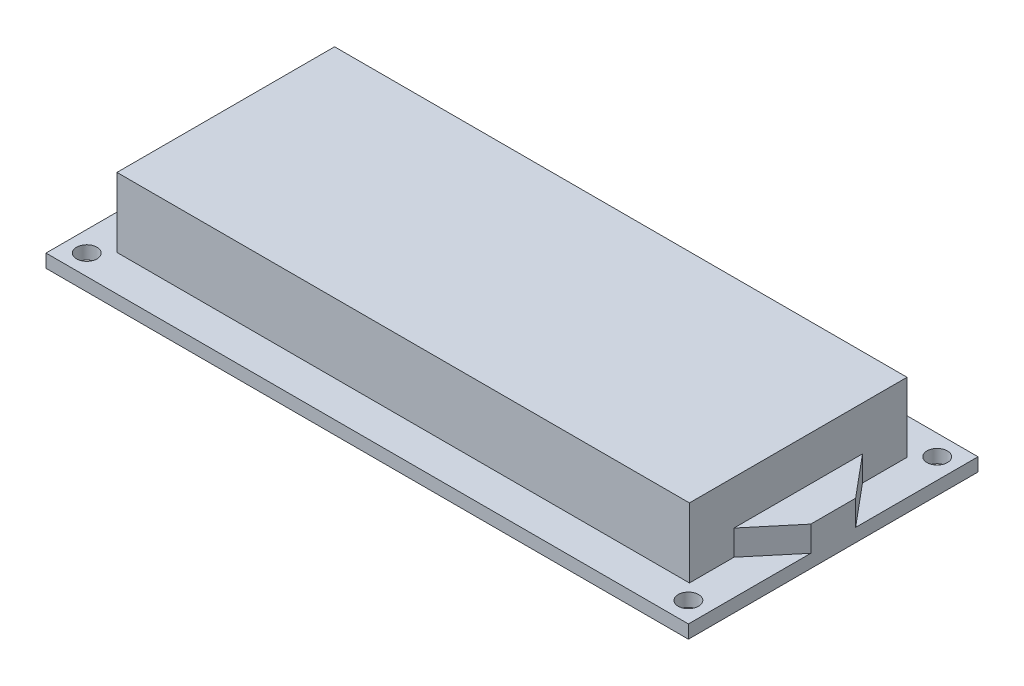
ISO-10303-21;
HEADER;
FILE_DESCRIPTION(('STEP AP214'),'2;1');
FILE_NAME('part.step','',(''),(''),'','','');
FILE_SCHEMA(('AUTOMOTIVE_DESIGN { 1 0 10303 214 1 1 1 1 }'));
ENDSEC;
DATA;
#1=APPLICATION_CONTEXT('core data for automotive mechanical design processes');
#2=APPLICATION_PROTOCOL_DEFINITION('international standard','automotive_design',2000,#1);
#3=PRODUCT_CONTEXT('',#1,'mechanical');
#4=PRODUCT('Part','Part','',(#3));
#5=PRODUCT_RELATED_PRODUCT_CATEGORY('part','',(#4));
#6=PRODUCT_DEFINITION_FORMATION('','',#4);
#7=PRODUCT_DEFINITION_CONTEXT('part definition',#1,'design');
#8=PRODUCT_DEFINITION('design','',#6,#7);
#9=PRODUCT_DEFINITION_SHAPE('','',#8);
#10=(LENGTH_UNIT() NAMED_UNIT(*) SI_UNIT(.MILLI.,.METRE.));
#11=(NAMED_UNIT(*) PLANE_ANGLE_UNIT() SI_UNIT($,.RADIAN.));
#12=(NAMED_UNIT(*) SI_UNIT($,.STERADIAN.) SOLID_ANGLE_UNIT());
#13=UNCERTAINTY_MEASURE_WITH_UNIT(LENGTH_MEASURE(1.E-05),#10,'distance_accuracy_value','');
#14=(GEOMETRIC_REPRESENTATION_CONTEXT(3) GLOBAL_UNCERTAINTY_ASSIGNED_CONTEXT((#13)) GLOBAL_UNIT_ASSIGNED_CONTEXT((#10,
#11,#12)) REPRESENTATION_CONTEXT('',''));
#15=CARTESIAN_POINT('',(0.,0.,0.));
#16=DIRECTION('',(0.,0.,1.));
#17=DIRECTION('',(1.,0.,0.));
#18=AXIS2_PLACEMENT_3D('',#15,#16,#17);
#19=CARTESIAN_POINT('',(0.,0.,0.));
#20=DIRECTION('',(0.,-1.,0.));
#21=DIRECTION('',(0.,0.,-1.));
#22=AXIS2_PLACEMENT_3D('',#19,#20,#21);
#23=PLANE('',#22);
#24=CARTESIAN_POINT('',(2.54,0.,-16.7088369093883));
#25=DIRECTION('',(0.,-1.,0.));
#26=DIRECTION('',(0.,0.,-1.));
#27=AXIS2_PLACEMENT_3D('',#24,#25,#26);
#28=CIRCLE('',#27,1.27);
#29=CARTESIAN_POINT('',(2.54,0.,-17.9788369093883));
#30=VERTEX_POINT('',#29);
#31=EDGE_CURVE('E43',#30,#30,#28,.T.);
#32=ORIENTED_EDGE('',*,*,#31,.F.);
#33=EDGE_LOOP('',(#32));
#34=FACE_BOUND('',#33,.T.);
#35=CARTESIAN_POINT('',(77.47,0.,-47.6968369093883));
#36=DIRECTION('',(0.,-1.,0.));
#37=DIRECTION('',(0.,0.,-1.));
#38=AXIS2_PLACEMENT_3D('',#35,#36,#37);
#39=CIRCLE('',#38,1.26999999999999);
#40=CARTESIAN_POINT('',(77.47,0.,-48.9668369093883));
#41=VERTEX_POINT('',#40);
#42=EDGE_CURVE('E392',#41,#41,#39,.T.);
#43=ORIENTED_EDGE('',*,*,#42,.F.);
#44=EDGE_LOOP('',(#43));
#45=FACE_BOUND('',#44,.T.);
#46=CARTESIAN_POINT('',(77.47,0.,-16.7088369093883));
#47=DIRECTION('',(0.,-1.,0.));
#48=DIRECTION('',(0.,0.,-1.));
#49=AXIS2_PLACEMENT_3D('',#46,#47,#48);
#50=CIRCLE('',#49,1.26999999999999);
#51=CARTESIAN_POINT('',(77.47,0.,-17.9788369093883));
#52=VERTEX_POINT('',#51);
#53=EDGE_CURVE('E389',#52,#52,#50,.T.);
#54=ORIENTED_EDGE('',*,*,#53,.F.);
#55=EDGE_LOOP('',(#54));
#56=FACE_BOUND('',#55,.T.);
#57=CARTESIAN_POINT('',(2.54,0.,-47.6968369093883));
#58=DIRECTION('',(0.,-1.,0.));
#59=DIRECTION('',(0.,0.,-1.));
#60=AXIS2_PLACEMENT_3D('',#57,#58,#59);
#61=CIRCLE('',#60,1.27);
#62=CARTESIAN_POINT('',(2.54,0.,-48.9668369093883));
#63=VERTEX_POINT('',#62);
#64=EDGE_CURVE('E345',#63,#63,#61,.T.);
#65=ORIENTED_EDGE('',*,*,#64,.F.);
#66=EDGE_LOOP('',(#65));
#67=FACE_BOUND('',#66,.T.);
#68=DIRECTION('',(0.,0.,1.));
#69=VECTOR('',#68,1.);
#70=CARTESIAN_POINT('',(0.,0.,-14.1688369093883));
#71=LINE('',#70,#69);
#72=CARTESIAN_POINT('',(0.,0.,-50.2368369093883));
#73=VERTEX_POINT('',#72);
#74=CARTESIAN_POINT('',(0.,0.,-14.1688369093883));
#75=VERTEX_POINT('',#74);
#76=EDGE_CURVE('E363',#73,#75,#71,.T.);
#77=ORIENTED_EDGE('',*,*,#76,.F.);
#78=DIRECTION('',(-1.,0.,0.));
#79=VECTOR('',#78,1.);
#80=CARTESIAN_POINT('',(0.,0.,-50.2368369093883));
#81=LINE('',#80,#79);
#82=CARTESIAN_POINT('',(80.01,0.,-50.2368369093883));
#83=VERTEX_POINT('',#82);
#84=EDGE_CURVE('E373',#83,#73,#81,.T.);
#85=ORIENTED_EDGE('',*,*,#84,.F.);
#86=DIRECTION('',(0.,0.,-1.));
#87=VECTOR('',#86,1.);
#88=CARTESIAN_POINT('',(80.01,0.,-14.1688369093883));
#89=LINE('',#88,#87);
#90=CARTESIAN_POINT('',(80.01,0.,-14.1688369093883));
#91=VERTEX_POINT('',#90);
#92=EDGE_CURVE('E370',#91,#83,#89,.T.);
#93=ORIENTED_EDGE('',*,*,#92,.F.);
#94=DIRECTION('',(1.,0.,0.));
#95=VECTOR('',#94,1.);
#96=CARTESIAN_POINT('',(0.,0.,-14.1688369093883));
#97=LINE('',#96,#95);
#98=EDGE_CURVE('E367',#75,#91,#97,.T.);
#99=ORIENTED_EDGE('',*,*,#98,.F.);
#100=EDGE_LOOP('',(#77,#85,#93,#99));
#101=FACE_BOUND('',#100,.T.);
#102=DIRECTION('',(1.,0.,0.));
#103=VECTOR('',#102,1.);
#104=CARTESIAN_POINT('',(41.275,0.,-22.1063369093883));
#105=LINE('',#104,#103);
#106=CARTESIAN_POINT('',(41.275,0.,-22.1063369093883));
#107=VERTEX_POINT('',#106);
#108=CARTESIAN_POINT('',(44.45,0.,-22.1063369093883));
#109=VERTEX_POINT('',#108);
#110=EDGE_CURVE('E417',#107,#109,#105,.T.);
#111=ORIENTED_EDGE('',*,*,#110,.F.);
#112=DIRECTION('',(0.,0.,-1.));
#113=VECTOR('',#112,1.);
#114=CARTESIAN_POINT('',(41.275,0.,-18.9313369093883));
#115=LINE('',#114,#113);
#116=CARTESIAN_POINT('',(41.275,0.,-18.9313369093883));
#117=VERTEX_POINT('',#116);
#118=EDGE_CURVE('E205',#117,#107,#115,.T.);
#119=ORIENTED_EDGE('',*,*,#118,.F.);
#120=DIRECTION('',(-1.,0.,0.));
#121=VECTOR('',#120,1.);
#122=CARTESIAN_POINT('',(41.275,0.,-18.9313369093883));
#123=LINE('',#122,#121);
#124=CARTESIAN_POINT('',(44.45,0.,-18.9313369093883));
#125=VERTEX_POINT('',#124);
#126=EDGE_CURVE('E201',#125,#117,#123,.T.);
#127=ORIENTED_EDGE('',*,*,#126,.F.);
#128=DIRECTION('',(0.,0.,1.));
#129=VECTOR('',#128,1.);
#130=CARTESIAN_POINT('',(44.45,0.,-18.9313369093883));
#131=LINE('',#130,#129);
#132=EDGE_CURVE('E419',#109,#125,#131,.T.);
#133=ORIENTED_EDGE('',*,*,#132,.F.);
#134=EDGE_LOOP('',(#111,#119,#127,#133));
#135=FACE_BOUND('',#134,.T.);
#136=ADVANCED_FACE('F39',(#34,#45,#56,#67,#101,#135),#23,.T.);
#137=CARTESIAN_POINT('',(0.,1.651,0.));
#138=DIRECTION('',(0.,-1.,0.));
#139=DIRECTION('',(0.,0.,-1.));
#140=AXIS2_PLACEMENT_3D('',#137,#138,#139);
#141=PLANE('',#140);
#142=CARTESIAN_POINT('',(77.47,1.651,-16.7088369093883));
#143=DIRECTION('',(0.,1.,0.));
#144=DIRECTION('',(0.,0.,1.));
#145=AXIS2_PLACEMENT_3D('',#142,#143,#144);
#146=CIRCLE('',#145,1.26999999999999);
#147=CARTESIAN_POINT('',(77.47,1.651,-15.4388369093883));
#148=VERTEX_POINT('',#147);
#149=EDGE_CURVE('E329',#148,#148,#146,.T.);
#150=ORIENTED_EDGE('',*,*,#149,.F.);
#151=EDGE_LOOP('',(#150));
#152=FACE_BOUND('',#151,.T.);
#153=CARTESIAN_POINT('',(2.54,1.651,-16.7088369093883));
#154=DIRECTION('',(0.,1.,0.));
#155=DIRECTION('',(0.,0.,1.));
#156=AXIS2_PLACEMENT_3D('',#153,#154,#155);
#157=CIRCLE('',#156,1.27);
#158=CARTESIAN_POINT('',(2.54,1.651,-15.4388369093883));
#159=VERTEX_POINT('',#158);
#160=EDGE_CURVE('E334',#159,#159,#157,.T.);
#161=ORIENTED_EDGE('',*,*,#160,.F.);
#162=EDGE_LOOP('',(#161));
#163=FACE_BOUND('',#162,.T.);
#164=DIRECTION('',(0.,0.,-1.));
#165=VECTOR('',#164,1.);
#166=CARTESIAN_POINT('',(80.01,1.651,-14.1688369093883));
#167=LINE('',#166,#165);
#168=CARTESIAN_POINT('',(80.01,1.651,-14.1688369093883));
#169=VERTEX_POINT('',#168);
#170=CARTESIAN_POINT('',(80.01,1.651,-29.4088369093883));
#171=VERTEX_POINT('',#170);
#172=EDGE_CURVE('E355',#169,#171,#167,.T.);
#173=ORIENTED_EDGE('',*,*,#172,.T.);
#174=DIRECTION('',(-0.641655262458499,0.,0.76699317086876));
#175=VECTOR('',#174,1.);
#176=CARTESIAN_POINT('',(80.01,1.651,-29.4088369093883));
#177=LINE('',#176,#175);
#178=CARTESIAN_POINT('',(75.6539,1.651,-24.2018369093883));
#179=VERTEX_POINT('',#178);
#180=EDGE_CURVE('E208',#171,#179,#177,.T.);
#181=ORIENTED_EDGE('',*,*,#180,.T.);
#182=DIRECTION('',(0.,0.,-1.));
#183=VECTOR('',#182,1.);
#184=CARTESIAN_POINT('',(75.6539,1.651,-45.7537369093883));
#185=LINE('',#184,#183);
#186=CARTESIAN_POINT('',(75.6539,1.651,-18.6519369093883));
#187=VERTEX_POINT('',#186);
#188=EDGE_CURVE('E307',#187,#179,#185,.T.);
#189=ORIENTED_EDGE('',*,*,#188,.F.);
#190=DIRECTION('',(1.,0.,0.));
#191=VECTOR('',#190,1.);
#192=CARTESIAN_POINT('',(4.3561,1.651,-18.6519369093883));
#193=LINE('',#192,#191);
#194=CARTESIAN_POINT('',(4.3561,1.651,-18.6519369093883));
#195=VERTEX_POINT('',#194);
#196=EDGE_CURVE('E302',#195,#187,#193,.T.);
#197=ORIENTED_EDGE('',*,*,#196,.F.);
#198=DIRECTION('',(0.,0.,1.));
#199=VECTOR('',#198,1.);
#200=CARTESIAN_POINT('',(4.3561,1.651,-45.7537369093883));
#201=LINE('',#200,#199);
#202=CARTESIAN_POINT('',(4.3561,1.651,-24.2018369093883));
#203=VERTEX_POINT('',#202);
#204=EDGE_CURVE('E282',#203,#195,#201,.T.);
#205=ORIENTED_EDGE('',*,*,#204,.F.);
#206=DIRECTION('',(0.641655262458499,0.,0.76699317086876));
#207=VECTOR('',#206,1.);
#208=CARTESIAN_POINT('',(0.,1.651,-29.4088369093883));
#209=LINE('',#208,#207);
#210=CARTESIAN_POINT('',(0.,1.651,-29.4088369093883));
#211=VERTEX_POINT('',#210);
#212=EDGE_CURVE('E254',#211,#203,#209,.T.);
#213=ORIENTED_EDGE('',*,*,#212,.F.);
#214=DIRECTION('',(0.,0.,1.));
#215=VECTOR('',#214,1.);
#216=CARTESIAN_POINT('',(0.,1.651,-14.1688369093883));
#217=LINE('',#216,#215);
#218=CARTESIAN_POINT('',(0.,1.651,-14.1688369093883));
#219=VERTEX_POINT('',#218);
#220=EDGE_CURVE('E351',#211,#219,#217,.T.);
#221=ORIENTED_EDGE('',*,*,#220,.T.);
#222=DIRECTION('',(1.,0.,0.));
#223=VECTOR('',#222,1.);
#224=CARTESIAN_POINT('',(0.,1.651,-14.1688369093883));
#225=LINE('',#224,#223);
#226=EDGE_CURVE('E350',#219,#169,#225,.T.);
#227=ORIENTED_EDGE('',*,*,#226,.T.);
#228=EDGE_LOOP('',(#173,#181,#189,#197,#205,#213,#221,#227));
#229=FACE_BOUND('',#228,.T.);
#230=ADVANCED_FACE('F406',(#152,#163,#229),#141,.F.);
#231=CARTESIAN_POINT('',(77.47,1.651,-47.6968369093883));
#232=DIRECTION('',(0.,1.,0.));
#233=DIRECTION('',(0.,0.,1.));
#234=AXIS2_PLACEMENT_3D('',#231,#232,#233);
#235=CIRCLE('',#234,1.26999999999999);
#236=CARTESIAN_POINT('',(77.47,1.651,-46.4268369093883));
#237=VERTEX_POINT('',#236);
#238=EDGE_CURVE('E333',#237,#237,#235,.T.);
#239=ORIENTED_EDGE('',*,*,#238,.F.);
#240=EDGE_LOOP('',(#239));
#241=FACE_BOUND('',#240,.T.);
#242=CARTESIAN_POINT('',(2.54,1.651,-47.6968369093883));
#243=DIRECTION('',(0.,1.,0.));
#244=DIRECTION('',(0.,0.,1.));
#245=AXIS2_PLACEMENT_3D('',#242,#243,#244);
#246=CIRCLE('',#245,1.27);
#247=CARTESIAN_POINT('',(2.54,1.651,-46.4268369093883));
#248=VERTEX_POINT('',#247);
#249=EDGE_CURVE('E338',#248,#248,#246,.T.);
#250=ORIENTED_EDGE('',*,*,#249,.F.);
#251=EDGE_LOOP('',(#250));
#252=FACE_BOUND('',#251,.T.);
#253=CARTESIAN_POINT('',(75.6539,1.651,-40.2038369093883));
#254=VERTEX_POINT('',#253);
#255=CARTESIAN_POINT('',(75.6539,1.651,-45.7537369093883));
#256=VERTEX_POINT('',#255);
#257=EDGE_CURVE('E306',#254,#256,#185,.T.);
#258=ORIENTED_EDGE('',*,*,#257,.F.);
#259=DIRECTION('',(0.641655262458499,0.,0.76699317086876));
#260=VECTOR('',#259,1.);
#261=CARTESIAN_POINT('',(75.6539,1.651,-40.2038369093883));
#262=LINE('',#261,#260);
#263=CARTESIAN_POINT('',(80.01,1.651,-34.9968369093883));
#264=VERTEX_POINT('',#263);
#265=EDGE_CURVE('E213',#254,#264,#262,.T.);
#266=ORIENTED_EDGE('',*,*,#265,.T.);
#267=CARTESIAN_POINT('',(80.01,1.651,-50.2368369093883));
#268=VERTEX_POINT('',#267);
#269=EDGE_CURVE('E354',#264,#268,#167,.T.);
#270=ORIENTED_EDGE('',*,*,#269,.T.);
#271=DIRECTION('',(-1.,0.,0.));
#272=VECTOR('',#271,1.);
#273=CARTESIAN_POINT('',(0.,1.651,-50.2368369093883));
#274=LINE('',#273,#272);
#275=CARTESIAN_POINT('',(0.,1.651,-50.2368369093883));
#276=VERTEX_POINT('',#275);
#277=EDGE_CURVE('E359',#268,#276,#274,.T.);
#278=ORIENTED_EDGE('',*,*,#277,.T.);
#279=CARTESIAN_POINT('',(0.,1.651,-34.9968369093883));
#280=VERTEX_POINT('',#279);
#281=EDGE_CURVE('E346',#276,#280,#217,.T.);
#282=ORIENTED_EDGE('',*,*,#281,.T.);
#283=DIRECTION('',(-0.641655262458499,0.,0.76699317086876));
#284=VECTOR('',#283,1.);
#285=CARTESIAN_POINT('',(4.3561,1.651,-40.2038369093883));
#286=LINE('',#285,#284);
#287=CARTESIAN_POINT('',(4.3561,1.651,-40.2038369093883));
#288=VERTEX_POINT('',#287);
#289=EDGE_CURVE('E248',#288,#280,#286,.T.);
#290=ORIENTED_EDGE('',*,*,#289,.F.);
#291=CARTESIAN_POINT('',(4.3561,1.651,-45.7537369093883));
#292=VERTEX_POINT('',#291);
#293=EDGE_CURVE('E298',#292,#288,#201,.T.);
#294=ORIENTED_EDGE('',*,*,#293,.F.);
#295=DIRECTION('',(-1.,0.,0.));
#296=VECTOR('',#295,1.);
#297=CARTESIAN_POINT('',(4.3561,1.651,-45.7537369093883));
#298=LINE('',#297,#296);
#299=EDGE_CURVE('E288',#256,#292,#298,.T.);
#300=ORIENTED_EDGE('',*,*,#299,.F.);
#301=EDGE_LOOP('',(#258,#266,#270,#278,#282,#290,#294,#300));
#302=FACE_BOUND('',#301,.T.);
#303=ADVANCED_FACE('F494',(#241,#252,#302),#141,.F.);
#304=CARTESIAN_POINT('',(4.3561,10.287,-45.7537369093883));
#305=DIRECTION('',(1.,0.,0.));
#306=DIRECTION('',(0.,0.,-1.));
#307=AXIS2_PLACEMENT_3D('',#304,#305,#306);
#308=PLANE('',#307);
#309=DIRECTION('',(0.,-1.,0.));
#310=VECTOR('',#309,1.);
#311=CARTESIAN_POINT('',(4.3561,4.8006,-40.2038369093883));
#312=LINE('',#311,#310);
#313=CARTESIAN_POINT('',(4.3561,4.8006,-40.2038369093883));
#314=VERTEX_POINT('',#313);
#315=EDGE_CURVE('E279',#314,#288,#312,.T.);
#316=ORIENTED_EDGE('',*,*,#315,.F.);
#317=DIRECTION('',(0.,0.,-1.));
#318=VECTOR('',#317,1.);
#319=CARTESIAN_POINT('',(4.3561,4.8006,-24.2018369093883));
#320=LINE('',#319,#318);
#321=CARTESIAN_POINT('',(4.3561,4.8006,-24.2018369093883));
#322=VERTEX_POINT('',#321);
#323=EDGE_CURVE('E249',#322,#314,#320,.T.);
#324=ORIENTED_EDGE('',*,*,#323,.F.);
#325=DIRECTION('',(0.,-1.,0.));
#326=VECTOR('',#325,1.);
#327=CARTESIAN_POINT('',(4.3561,4.8006,-24.2018369093883));
#328=LINE('',#327,#326);
#329=EDGE_CURVE('E264',#322,#203,#328,.T.);
#330=ORIENTED_EDGE('',*,*,#329,.T.);
#331=ORIENTED_EDGE('',*,*,#204,.T.);
#332=DIRECTION('',(0.,-1.,0.));
#333=VECTOR('',#332,1.);
#334=CARTESIAN_POINT('',(4.3561,10.287,-18.6519369093883));
#335=LINE('',#334,#333);
#336=CARTESIAN_POINT('',(4.3561,10.287,-18.6519369093883));
#337=VERTEX_POINT('',#336);
#338=EDGE_CURVE('E325',#337,#195,#335,.T.);
#339=ORIENTED_EDGE('',*,*,#338,.F.);
#340=DIRECTION('',(0.,0.,1.));
#341=VECTOR('',#340,1.);
#342=CARTESIAN_POINT('',(4.3561,10.287,-45.7537369093883));
#343=LINE('',#342,#341);
#344=CARTESIAN_POINT('',(4.3561,10.287,-45.7537369093883));
#345=VERTEX_POINT('',#344);
#346=EDGE_CURVE('E283',#345,#337,#343,.T.);
#347=ORIENTED_EDGE('',*,*,#346,.F.);
#348=DIRECTION('',(0.,-1.,0.));
#349=VECTOR('',#348,1.);
#350=CARTESIAN_POINT('',(4.3561,10.287,-45.7537369093883));
#351=LINE('',#350,#349);
#352=EDGE_CURVE('E297',#345,#292,#351,.T.);
#353=ORIENTED_EDGE('',*,*,#352,.T.);
#354=ORIENTED_EDGE('',*,*,#293,.T.);
#355=EDGE_LOOP('',(#316,#324,#330,#331,#339,#347,#353,#354));
#356=FACE_BOUND('',#355,.T.);
#357=ADVANCED_FACE('F491',(#356),#308,.F.);
#358=CARTESIAN_POINT('',(0.,1.651,-14.1688369093883));
#359=DIRECTION('',(1.,0.,0.));
#360=DIRECTION('',(0.,0.,-1.));
#361=AXIS2_PLACEMENT_3D('',#358,#359,#360);
#362=PLANE('',#361);
#363=ORIENTED_EDGE('',*,*,#76,.T.);
#364=DIRECTION('',(0.,-1.,0.));
#365=VECTOR('',#364,1.);
#366=CARTESIAN_POINT('',(0.,1.651,-14.1688369093883));
#367=LINE('',#366,#365);
#368=EDGE_CURVE('E11',#219,#75,#367,.T.);
#369=ORIENTED_EDGE('',*,*,#368,.F.);
#370=ORIENTED_EDGE('',*,*,#220,.F.);
#371=DIRECTION('',(0.,-1.,0.));
#372=VECTOR('',#371,1.);
#373=CARTESIAN_POINT('',(0.,4.8006,-29.4088369093883));
#374=LINE('',#373,#372);
#375=CARTESIAN_POINT('',(0.,4.8006,-29.4088369093883));
#376=VERTEX_POINT('',#375);
#377=EDGE_CURVE('E272',#376,#211,#374,.T.);
#378=ORIENTED_EDGE('',*,*,#377,.F.);
#379=DIRECTION('',(0.,0.,1.));
#380=VECTOR('',#379,1.);
#381=CARTESIAN_POINT('',(0.,4.8006,-34.9968369093883));
#382=LINE('',#381,#380);
#383=CARTESIAN_POINT('',(0.,4.8006,-34.9968369093883));
#384=VERTEX_POINT('',#383);
#385=EDGE_CURVE('E257',#384,#376,#382,.T.);
#386=ORIENTED_EDGE('',*,*,#385,.F.);
#387=DIRECTION('',(0.,-1.,0.));
#388=VECTOR('',#387,1.);
#389=CARTESIAN_POINT('',(0.,4.8006,-34.9968369093883));
#390=LINE('',#389,#388);
#391=EDGE_CURVE('E275',#384,#280,#390,.T.);
#392=ORIENTED_EDGE('',*,*,#391,.T.);
#393=ORIENTED_EDGE('',*,*,#281,.F.);
#394=DIRECTION('',(0.,-1.,0.));
#395=VECTOR('',#394,1.);
#396=CARTESIAN_POINT('',(0.,1.651,-50.2368369093883));
#397=LINE('',#396,#395);
#398=EDGE_CURVE('E362',#276,#73,#397,.T.);
#399=ORIENTED_EDGE('',*,*,#398,.T.);
#400=EDGE_LOOP('',(#363,#369,#370,#378,#386,#392,#393,#399));
#401=FACE_BOUND('',#400,.T.);
#402=ADVANCED_FACE('F41',(#401),#362,.F.);
#403=CARTESIAN_POINT('',(0.,1.651,-14.1688369093883));
#404=DIRECTION('',(0.,0.,-1.));
#405=DIRECTION('',(-1.,0.,0.));
#406=AXIS2_PLACEMENT_3D('',#403,#404,#405);
#407=PLANE('',#406);
#408=ORIENTED_EDGE('',*,*,#98,.T.);
#409=DIRECTION('',(0.,-1.,0.));
#410=VECTOR('',#409,1.);
#411=CARTESIAN_POINT('',(80.01,1.651,-14.1688369093883));
#412=LINE('',#411,#410);
#413=EDGE_CURVE('E49',#169,#91,#412,.T.);
#414=ORIENTED_EDGE('',*,*,#413,.F.);
#415=ORIENTED_EDGE('',*,*,#226,.F.);
#416=ORIENTED_EDGE('',*,*,#368,.T.);
#417=EDGE_LOOP('',(#408,#414,#415,#416));
#418=FACE_BOUND('',#417,.T.);
#419=ADVANCED_FACE('F518',(#418),#407,.F.);
#420=CARTESIAN_POINT('',(80.01,1.651,-14.1688369093883));
#421=DIRECTION('',(-1.,0.,0.));
#422=DIRECTION('',(0.,0.,1.));
#423=AXIS2_PLACEMENT_3D('',#420,#421,#422);
#424=PLANE('',#423);
#425=ORIENTED_EDGE('',*,*,#92,.T.);
#426=DIRECTION('',(0.,-1.,0.));
#427=VECTOR('',#426,1.);
#428=CARTESIAN_POINT('',(80.01,1.651,-50.2368369093883));
#429=LINE('',#428,#427);
#430=EDGE_CURVE('E379',#268,#83,#429,.T.);
#431=ORIENTED_EDGE('',*,*,#430,.F.);
#432=ORIENTED_EDGE('',*,*,#269,.F.);
#433=DIRECTION('',(0.,-1.,0.));
#434=VECTOR('',#433,1.);
#435=CARTESIAN_POINT('',(80.01,4.8006,-34.9968369093883));
#436=LINE('',#435,#434);
#437=CARTESIAN_POINT('',(80.01,4.8006,-34.9968369093883));
#438=VERTEX_POINT('',#437);
#439=EDGE_CURVE('E239',#438,#264,#436,.T.);
#440=ORIENTED_EDGE('',*,*,#439,.F.);
#441=DIRECTION('',(0.,0.,1.));
#442=VECTOR('',#441,1.);
#443=CARTESIAN_POINT('',(80.01,4.8006,-34.9968369093883));
#444=LINE('',#443,#442);
#445=CARTESIAN_POINT('',(80.01,4.8006,-29.4088369093883));
#446=VERTEX_POINT('',#445);
#447=EDGE_CURVE('E226',#438,#446,#444,.T.);
#448=ORIENTED_EDGE('',*,*,#447,.T.);
#449=DIRECTION('',(0.,-1.,0.));
#450=VECTOR('',#449,1.);
#451=CARTESIAN_POINT('',(80.01,4.8006,-29.4088369093883));
#452=LINE('',#451,#450);
#453=EDGE_CURVE('E242',#446,#171,#452,.T.);
#454=ORIENTED_EDGE('',*,*,#453,.T.);
#455=ORIENTED_EDGE('',*,*,#172,.F.);
#456=ORIENTED_EDGE('',*,*,#413,.T.);
#457=EDGE_LOOP('',(#425,#431,#432,#440,#448,#454,#455,#456));
#458=FACE_BOUND('',#457,.T.);
#459=ADVANCED_FACE('F515',(#458),#424,.F.);
#460=CARTESIAN_POINT('',(0.,1.651,-50.2368369093883));
#461=DIRECTION('',(0.,0.,1.));
#462=DIRECTION('',(1.,0.,0.));
#463=AXIS2_PLACEMENT_3D('',#460,#461,#462);
#464=PLANE('',#463);
#465=ORIENTED_EDGE('',*,*,#84,.T.);
#466=ORIENTED_EDGE('',*,*,#398,.F.);
#467=ORIENTED_EDGE('',*,*,#277,.F.);
#468=ORIENTED_EDGE('',*,*,#430,.T.);
#469=EDGE_LOOP('',(#465,#466,#467,#468));
#470=FACE_BOUND('',#469,.T.);
#471=ADVANCED_FACE('F508',(#470),#464,.F.);
#472=CARTESIAN_POINT('',(2.54,-0.889,-47.6968369093883));
#473=DIRECTION('',(0.,1.,0.));
#474=DIRECTION('',(0.,0.,1.));
#475=AXIS2_PLACEMENT_3D('',#472,#473,#474);
#476=CYLINDRICAL_SURFACE('',#475,1.27);
#477=ORIENTED_EDGE('',*,*,#64,.T.);
#478=EDGE_LOOP('',(#477));
#479=FACE_BOUND('',#478,.T.);
#480=ORIENTED_EDGE('',*,*,#249,.T.);
#481=EDGE_LOOP('',(#480));
#482=FACE_BOUND('',#481,.T.);
#483=ADVANCED_FACE('F500',(#479,#482),#476,.F.);
#484=CARTESIAN_POINT('',(77.47,-0.889,-16.7088369093883));
#485=DIRECTION('',(0.,1.,0.));
#486=DIRECTION('',(0.,0.,1.));
#487=AXIS2_PLACEMENT_3D('',#484,#485,#486);
#488=CYLINDRICAL_SURFACE('',#487,1.26999999999999);
#489=ORIENTED_EDGE('',*,*,#53,.T.);
#490=EDGE_LOOP('',(#489));
#491=FACE_BOUND('',#490,.T.);
#492=ORIENTED_EDGE('',*,*,#149,.T.);
#493=EDGE_LOOP('',(#492));
#494=FACE_BOUND('',#493,.T.);
#495=ADVANCED_FACE('F496',(#491,#494),#488,.F.);
#496=CARTESIAN_POINT('',(77.47,-0.889,-47.6968369093883));
#497=DIRECTION('',(0.,1.,0.));
#498=DIRECTION('',(0.,0.,1.));
#499=AXIS2_PLACEMENT_3D('',#496,#497,#498);
#500=CYLINDRICAL_SURFACE('',#499,1.26999999999999);
#501=ORIENTED_EDGE('',*,*,#42,.T.);
#502=EDGE_LOOP('',(#501));
#503=FACE_BOUND('',#502,.T.);
#504=ORIENTED_EDGE('',*,*,#238,.T.);
#505=EDGE_LOOP('',(#504));
#506=FACE_BOUND('',#505,.T.);
#507=ADVANCED_FACE('F499',(#503,#506),#500,.F.);
#508=CARTESIAN_POINT('',(2.54,-0.889,-16.7088369093883));
#509=DIRECTION('',(0.,1.,0.));
#510=DIRECTION('',(0.,0.,1.));
#511=AXIS2_PLACEMENT_3D('',#508,#509,#510);
#512=CYLINDRICAL_SURFACE('',#511,1.27);
#513=ORIENTED_EDGE('',*,*,#31,.T.);
#514=EDGE_LOOP('',(#513));
#515=FACE_BOUND('',#514,.T.);
#516=ORIENTED_EDGE('',*,*,#160,.T.);
#517=EDGE_LOOP('',(#516));
#518=FACE_BOUND('',#517,.T.);
#519=ADVANCED_FACE('F401',(#515,#518),#512,.F.);
#520=CARTESIAN_POINT('',(4.3561,10.287,-18.6519369093883));
#521=DIRECTION('',(0.,0.,-1.));
#522=DIRECTION('',(-1.,0.,0.));
#523=AXIS2_PLACEMENT_3D('',#520,#521,#522);
#524=PLANE('',#523);
#525=ORIENTED_EDGE('',*,*,#196,.T.);
#526=DIRECTION('',(0.,-1.,0.));
#527=VECTOR('',#526,1.);
#528=CARTESIAN_POINT('',(75.6539,10.287,-18.6519369093883));
#529=LINE('',#528,#527);
#530=CARTESIAN_POINT('',(75.6539,10.287,-18.6519369093883));
#531=VERTEX_POINT('',#530);
#532=EDGE_CURVE('E321',#531,#187,#529,.T.);
#533=ORIENTED_EDGE('',*,*,#532,.F.);
#534=DIRECTION('',(1.,0.,0.));
#535=VECTOR('',#534,1.);
#536=CARTESIAN_POINT('',(4.3561,10.287,-18.6519369093883));
#537=LINE('',#536,#535);
#538=EDGE_CURVE('E287',#337,#531,#537,.T.);
#539=ORIENTED_EDGE('',*,*,#538,.F.);
#540=ORIENTED_EDGE('',*,*,#338,.T.);
#541=EDGE_LOOP('',(#525,#533,#539,#540));
#542=FACE_BOUND('',#541,.T.);
#543=ADVANCED_FACE('F486',(#542),#524,.F.);
#544=CARTESIAN_POINT('',(75.6539,10.287,-45.7537369093883));
#545=DIRECTION('',(-1.,0.,0.));
#546=DIRECTION('',(0.,0.,1.));
#547=AXIS2_PLACEMENT_3D('',#544,#545,#546);
#548=PLANE('',#547);
#549=ORIENTED_EDGE('',*,*,#188,.T.);
#550=DIRECTION('',(0.,-1.,0.));
#551=VECTOR('',#550,1.);
#552=CARTESIAN_POINT('',(75.6539,4.8006,-24.2018369093883));
#553=LINE('',#552,#551);
#554=CARTESIAN_POINT('',(75.6539,4.8006,-24.2018369093883));
#555=VERTEX_POINT('',#554);
#556=EDGE_CURVE('E245',#555,#179,#553,.T.);
#557=ORIENTED_EDGE('',*,*,#556,.F.);
#558=DIRECTION('',(0.,0.,-1.));
#559=VECTOR('',#558,1.);
#560=CARTESIAN_POINT('',(75.6539,4.8006,-24.2018369093883));
#561=LINE('',#560,#559);
#562=CARTESIAN_POINT('',(75.6539,4.8006,-40.2038369093883));
#563=VERTEX_POINT('',#562);
#564=EDGE_CURVE('E218',#555,#563,#561,.T.);
#565=ORIENTED_EDGE('',*,*,#564,.T.);
#566=DIRECTION('',(0.,-1.,0.));
#567=VECTOR('',#566,1.);
#568=CARTESIAN_POINT('',(75.6539,4.8006,-40.2038369093883));
#569=LINE('',#568,#567);
#570=EDGE_CURVE('E231',#563,#254,#569,.T.);
#571=ORIENTED_EDGE('',*,*,#570,.T.);
#572=ORIENTED_EDGE('',*,*,#257,.T.);
#573=DIRECTION('',(0.,-1.,0.));
#574=VECTOR('',#573,1.);
#575=CARTESIAN_POINT('',(75.6539,10.287,-45.7537369093883));
#576=LINE('',#575,#574);
#577=CARTESIAN_POINT('',(75.6539,10.287,-45.7537369093883));
#578=VERTEX_POINT('',#577);
#579=EDGE_CURVE('E317',#578,#256,#576,.T.);
#580=ORIENTED_EDGE('',*,*,#579,.F.);
#581=DIRECTION('',(0.,0.,-1.));
#582=VECTOR('',#581,1.);
#583=CARTESIAN_POINT('',(75.6539,10.287,-45.7537369093883));
#584=LINE('',#583,#582);
#585=EDGE_CURVE('E291',#531,#578,#584,.T.);
#586=ORIENTED_EDGE('',*,*,#585,.F.);
#587=ORIENTED_EDGE('',*,*,#532,.T.);
#588=EDGE_LOOP('',(#549,#557,#565,#571,#572,#580,#586,#587));
#589=FACE_BOUND('',#588,.T.);
#590=ADVANCED_FACE('F482',(#589),#548,.F.);
#591=CARTESIAN_POINT('',(4.3561,10.287,-45.7537369093883));
#592=DIRECTION('',(0.,0.,1.));
#593=DIRECTION('',(1.,0.,0.));
#594=AXIS2_PLACEMENT_3D('',#591,#592,#593);
#595=PLANE('',#594);
#596=ORIENTED_EDGE('',*,*,#299,.T.);
#597=ORIENTED_EDGE('',*,*,#352,.F.);
#598=DIRECTION('',(-1.,0.,0.));
#599=VECTOR('',#598,1.);
#600=CARTESIAN_POINT('',(4.3561,10.287,-45.7537369093883));
#601=LINE('',#600,#599);
#602=EDGE_CURVE('E294',#578,#345,#601,.T.);
#603=ORIENTED_EDGE('',*,*,#602,.F.);
#604=ORIENTED_EDGE('',*,*,#579,.T.);
#605=EDGE_LOOP('',(#596,#597,#603,#604));
#606=FACE_BOUND('',#605,.T.);
#607=ADVANCED_FACE('F478',(#606),#595,.F.);
#608=CARTESIAN_POINT('',(0.,10.287,0.));
#609=DIRECTION('',(0.,1.,0.));
#610=DIRECTION('',(0.,0.,1.));
#611=AXIS2_PLACEMENT_3D('',#608,#609,#610);
#612=PLANE('',#611);
#613=ORIENTED_EDGE('',*,*,#346,.T.);
#614=ORIENTED_EDGE('',*,*,#538,.T.);
#615=ORIENTED_EDGE('',*,*,#585,.T.);
#616=ORIENTED_EDGE('',*,*,#602,.T.);
#617=EDGE_LOOP('',(#613,#614,#615,#616));
#618=FACE_BOUND('',#617,.T.);
#619=ADVANCED_FACE('F474',(#618),#612,.T.);
#620=CARTESIAN_POINT('',(4.3561,4.8006,-40.2038369093883));
#621=DIRECTION('',(0.76699317086876,0.,0.641655262458499));
#622=DIRECTION('',(0.641655262458499,0.,-0.76699317086876));
#623=AXIS2_PLACEMENT_3D('',#620,#621,#622);
#624=PLANE('',#623);
#625=ORIENTED_EDGE('',*,*,#289,.T.);
#626=ORIENTED_EDGE('',*,*,#391,.F.);
#627=DIRECTION('',(-0.641655262458499,0.,0.76699317086876));
#628=VECTOR('',#627,1.);
#629=CARTESIAN_POINT('',(4.3561,4.8006,-40.2038369093883));
#630=LINE('',#629,#628);
#631=EDGE_CURVE('E253',#314,#384,#630,.T.);
#632=ORIENTED_EDGE('',*,*,#631,.F.);
#633=ORIENTED_EDGE('',*,*,#315,.T.);
#634=EDGE_LOOP('',(#625,#626,#632,#633));
#635=FACE_BOUND('',#634,.T.);
#636=ADVANCED_FACE('F470',(#635),#624,.F.);
#637=CARTESIAN_POINT('',(0.,4.8006,-29.4088369093883));
#638=DIRECTION('',(0.76699317086876,0.,-0.641655262458499));
#639=DIRECTION('',(-0.641655262458499,0.,-0.76699317086876));
#640=AXIS2_PLACEMENT_3D('',#637,#638,#639);
#641=PLANE('',#640);
#642=ORIENTED_EDGE('',*,*,#212,.T.);
#643=ORIENTED_EDGE('',*,*,#329,.F.);
#644=DIRECTION('',(0.641655262458499,0.,0.76699317086876));
#645=VECTOR('',#644,1.);
#646=CARTESIAN_POINT('',(0.,4.8006,-29.4088369093883));
#647=LINE('',#646,#645);
#648=EDGE_CURVE('E260',#376,#322,#647,.T.);
#649=ORIENTED_EDGE('',*,*,#648,.F.);
#650=ORIENTED_EDGE('',*,*,#377,.T.);
#651=EDGE_LOOP('',(#642,#643,#649,#650));
#652=FACE_BOUND('',#651,.T.);
#653=ADVANCED_FACE('F466',(#652),#641,.F.);
#654=CARTESIAN_POINT('',(0.,4.8006,0.));
#655=DIRECTION('',(0.,1.,0.));
#656=DIRECTION('',(0.,0.,1.));
#657=AXIS2_PLACEMENT_3D('',#654,#655,#656);
#658=PLANE('',#657);
#659=ORIENTED_EDGE('',*,*,#323,.T.);
#660=ORIENTED_EDGE('',*,*,#631,.T.);
#661=ORIENTED_EDGE('',*,*,#385,.T.);
#662=ORIENTED_EDGE('',*,*,#648,.T.);
#663=EDGE_LOOP('',(#659,#660,#661,#662));
#664=FACE_BOUND('',#663,.T.);
#665=ADVANCED_FACE('F462',(#664),#658,.T.);
#666=CARTESIAN_POINT('',(80.01,4.8006,-29.4088369093883));
#667=DIRECTION('',(0.76699317086876,0.,0.641655262458499));
#668=DIRECTION('',(0.641655262458499,0.,-0.76699317086876));
#669=AXIS2_PLACEMENT_3D('',#666,#667,#668);
#670=PLANE('',#669);
#671=ORIENTED_EDGE('',*,*,#180,.F.);
#672=ORIENTED_EDGE('',*,*,#453,.F.);
#673=DIRECTION('',(-0.641655262458499,0.,0.76699317086876));
#674=VECTOR('',#673,1.);
#675=CARTESIAN_POINT('',(80.01,4.8006,-29.4088369093883));
#676=LINE('',#675,#674);
#677=EDGE_CURVE('E222',#446,#555,#676,.T.);
#678=ORIENTED_EDGE('',*,*,#677,.T.);
#679=ORIENTED_EDGE('',*,*,#556,.T.);
#680=EDGE_LOOP('',(#671,#672,#678,#679));
#681=FACE_BOUND('',#680,.T.);
#682=ADVANCED_FACE('F458',(#681),#670,.T.);
#683=CARTESIAN_POINT('',(75.6539,4.8006,-40.2038369093883));
#684=DIRECTION('',(0.76699317086876,0.,-0.641655262458499));
#685=DIRECTION('',(-0.641655262458499,0.,-0.76699317086876));
#686=AXIS2_PLACEMENT_3D('',#683,#684,#685);
#687=PLANE('',#686);
#688=ORIENTED_EDGE('',*,*,#265,.F.);
#689=ORIENTED_EDGE('',*,*,#570,.F.);
#690=DIRECTION('',(0.641655262458499,0.,0.76699317086876));
#691=VECTOR('',#690,1.);
#692=CARTESIAN_POINT('',(75.6539,4.8006,-40.2038369093883));
#693=LINE('',#692,#691);
#694=EDGE_CURVE('E65',#563,#438,#693,.T.);
#695=ORIENTED_EDGE('',*,*,#694,.T.);
#696=ORIENTED_EDGE('',*,*,#439,.T.);
#697=EDGE_LOOP('',(#688,#689,#695,#696));
#698=FACE_BOUND('',#697,.T.);
#699=ADVANCED_FACE('F455',(#698),#687,.T.);
#700=CARTESIAN_POINT('',(80.01,4.8006,0.));
#701=DIRECTION('',(0.,1.,0.));
#702=DIRECTION('',(0.,0.,1.));
#703=AXIS2_PLACEMENT_3D('',#700,#701,#702);
#704=PLANE('',#703);
#705=ORIENTED_EDGE('',*,*,#564,.F.);
#706=ORIENTED_EDGE('',*,*,#677,.F.);
#707=ORIENTED_EDGE('',*,*,#447,.F.);
#708=ORIENTED_EDGE('',*,*,#694,.F.);
#709=EDGE_LOOP('',(#705,#706,#707,#708));
#710=FACE_BOUND('',#709,.T.);
#711=ADVANCED_FACE('F452',(#710),#704,.T.);
#712=CARTESIAN_POINT('',(41.275,-2.38125,-18.9313369093883));
#713=DIRECTION('',(1.,0.,0.));
#714=DIRECTION('',(0.,0.,-1.));
#715=AXIS2_PLACEMENT_3D('',#712,#713,#714);
#716=PLANE('',#715);
#717=ORIENTED_EDGE('',*,*,#118,.T.);
#718=DIRECTION('',(0.,1.,0.));
#719=VECTOR('',#718,1.);
#720=CARTESIAN_POINT('',(41.275,-2.38125,-22.1063369093883));
#721=LINE('',#720,#719);
#722=CARTESIAN_POINT('',(41.275,-2.38125,-22.1063369093883));
#723=VERTEX_POINT('',#722);
#724=EDGE_CURVE('E184',#723,#107,#721,.T.);
#725=ORIENTED_EDGE('',*,*,#724,.F.);
#726=DIRECTION('',(0.,0.,-1.));
#727=VECTOR('',#726,1.);
#728=CARTESIAN_POINT('',(41.275,-2.38125,-18.9313369093883));
#729=LINE('',#728,#727);
#730=CARTESIAN_POINT('',(41.275,-2.38125,-18.9313369093883));
#731=VERTEX_POINT('',#730);
#732=EDGE_CURVE('E192',#731,#723,#729,.T.);
#733=ORIENTED_EDGE('',*,*,#732,.F.);
#734=DIRECTION('',(0.,1.,0.));
#735=VECTOR('',#734,1.);
#736=CARTESIAN_POINT('',(41.275,-2.38125,-18.9313369093883));
#737=LINE('',#736,#735);
#738=EDGE_CURVE('E430',#731,#117,#737,.T.);
#739=ORIENTED_EDGE('',*,*,#738,.T.);
#740=EDGE_LOOP('',(#717,#725,#733,#739));
#741=FACE_BOUND('',#740,.T.);
#742=ADVANCED_FACE('F203',(#741),#716,.F.);
#743=CARTESIAN_POINT('',(41.275,-2.38125,-22.1063369093883));
#744=DIRECTION('',(0.,0.,1.));
#745=DIRECTION('',(1.,0.,0.));
#746=AXIS2_PLACEMENT_3D('',#743,#744,#745);
#747=PLANE('',#746);
#748=ORIENTED_EDGE('',*,*,#110,.T.);
#749=DIRECTION('',(0.,1.,0.));
#750=VECTOR('',#749,1.);
#751=CARTESIAN_POINT('',(44.45,-2.38125,-22.1063369093883));
#752=LINE('',#751,#750);
#753=CARTESIAN_POINT('',(44.45,-2.38125,-22.1063369093883));
#754=VERTEX_POINT('',#753);
#755=EDGE_CURVE('E187',#754,#109,#752,.T.);
#756=ORIENTED_EDGE('',*,*,#755,.F.);
#757=DIRECTION('',(1.,0.,0.));
#758=VECTOR('',#757,1.);
#759=CARTESIAN_POINT('',(41.275,-2.38125,-22.1063369093883));
#760=LINE('',#759,#758);
#761=EDGE_CURVE('E180',#723,#754,#760,.T.);
#762=ORIENTED_EDGE('',*,*,#761,.F.);
#763=ORIENTED_EDGE('',*,*,#724,.T.);
#764=EDGE_LOOP('',(#748,#756,#762,#763));
#765=FACE_BOUND('',#764,.T.);
#766=ADVANCED_FACE('F182',(#765),#747,.F.);
#767=CARTESIAN_POINT('',(44.45,-2.38125,-18.9313369093883));
#768=DIRECTION('',(-1.,0.,0.));
#769=DIRECTION('',(0.,0.,1.));
#770=AXIS2_PLACEMENT_3D('',#767,#768,#769);
#771=PLANE('',#770);
#772=ORIENTED_EDGE('',*,*,#132,.T.);
#773=DIRECTION('',(0.,1.,0.));
#774=VECTOR('',#773,1.);
#775=CARTESIAN_POINT('',(44.45,-2.38125,-18.9313369093883));
#776=LINE('',#775,#774);
#777=CARTESIAN_POINT('',(44.45,-2.38125,-18.9313369093883));
#778=VERTEX_POINT('',#777);
#779=EDGE_CURVE('E57',#778,#125,#776,.T.);
#780=ORIENTED_EDGE('',*,*,#779,.F.);
#781=DIRECTION('',(0.,0.,1.));
#782=VECTOR('',#781,1.);
#783=CARTESIAN_POINT('',(44.45,-2.38125,-18.9313369093883));
#784=LINE('',#783,#782);
#785=EDGE_CURVE('E191',#754,#778,#784,.T.);
#786=ORIENTED_EDGE('',*,*,#785,.F.);
#787=ORIENTED_EDGE('',*,*,#755,.T.);
#788=EDGE_LOOP('',(#772,#780,#786,#787));
#789=FACE_BOUND('',#788,.T.);
#790=ADVANCED_FACE('F437',(#789),#771,.F.);
#791=CARTESIAN_POINT('',(41.275,-2.38125,-18.9313369093883));
#792=DIRECTION('',(0.,0.,-1.));
#793=DIRECTION('',(-1.,0.,0.));
#794=AXIS2_PLACEMENT_3D('',#791,#792,#793);
#795=PLANE('',#794);
#796=ORIENTED_EDGE('',*,*,#126,.T.);
#797=ORIENTED_EDGE('',*,*,#738,.F.);
#798=DIRECTION('',(-1.,0.,0.));
#799=VECTOR('',#798,1.);
#800=CARTESIAN_POINT('',(41.275,-2.38125,-18.9313369093883));
#801=LINE('',#800,#799);
#802=EDGE_CURVE('E196',#778,#731,#801,.T.);
#803=ORIENTED_EDGE('',*,*,#802,.F.);
#804=ORIENTED_EDGE('',*,*,#779,.T.);
#805=EDGE_LOOP('',(#796,#797,#803,#804));
#806=FACE_BOUND('',#805,.T.);
#807=ADVANCED_FACE('F438',(#806),#795,.F.);
#808=CARTESIAN_POINT('',(0.,-2.38125,0.));
#809=DIRECTION('',(0.,-1.,0.));
#810=DIRECTION('',(0.,0.,-1.));
#811=AXIS2_PLACEMENT_3D('',#808,#809,#810);
#812=PLANE('',#811);
#813=ORIENTED_EDGE('',*,*,#732,.T.);
#814=ORIENTED_EDGE('',*,*,#761,.T.);
#815=ORIENTED_EDGE('',*,*,#785,.T.);
#816=ORIENTED_EDGE('',*,*,#802,.T.);
#817=EDGE_LOOP('',(#813,#814,#815,#816));
#818=FACE_BOUND('',#817,.T.);
#819=ADVANCED_FACE('F195',(#818),#812,.T.);
#820=CLOSED_SHELL('',(#136,#230,#303,#357,#402,#419,#459,#471,#483,#495,#507,#519,#543,#590,
#607,#619,#636,#653,#665,#682,#699,#711,#742,#766,#790,#807,#819));
#821=MANIFOLD_SOLID_BREP('B2',#820);
#822=ADVANCED_BREP_SHAPE_REPRESENTATION('',(#18,#821),#14);
#823=SHAPE_DEFINITION_REPRESENTATION(#9,#822);
ENDSEC;
END-ISO-10303-21;
